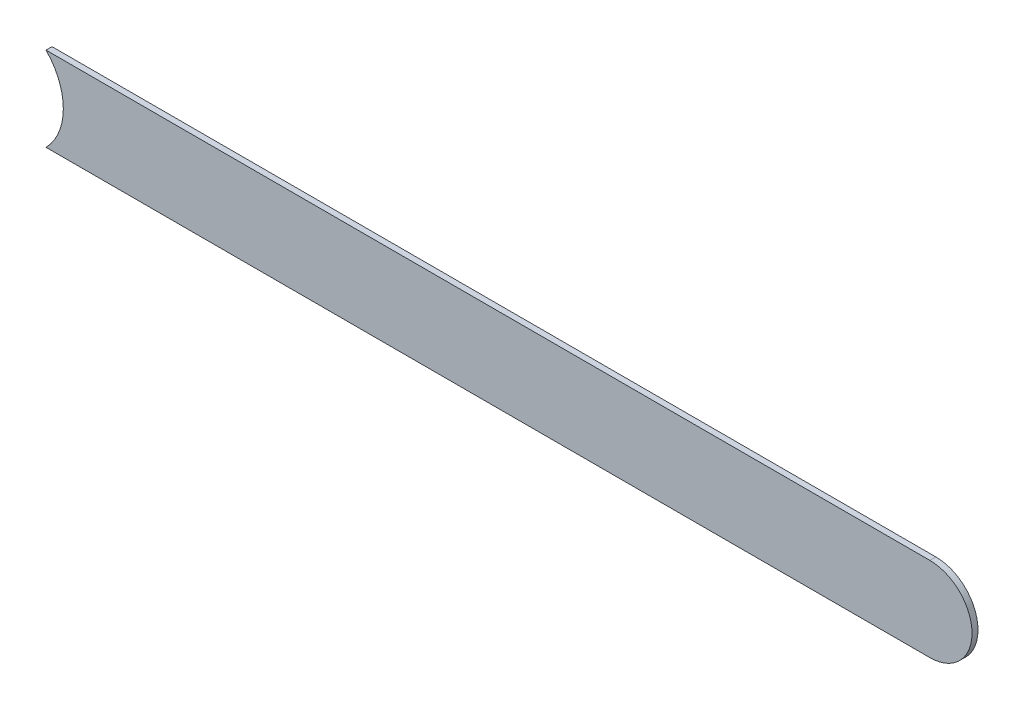
ISO-10303-21;
HEADER;
FILE_DESCRIPTION(('STEP AP214'),'2;1');
FILE_NAME('part.step','',(''),(''),'','','');
FILE_SCHEMA(('AUTOMOTIVE_DESIGN { 1 0 10303 214 1 1 1 1 }'));
ENDSEC;
DATA;
#1=APPLICATION_CONTEXT('core data for automotive mechanical design processes');
#2=APPLICATION_PROTOCOL_DEFINITION('international standard','automotive_design',2000,#1);
#3=PRODUCT_CONTEXT('',#1,'mechanical');
#4=PRODUCT('Part','Part','',(#3));
#5=PRODUCT_RELATED_PRODUCT_CATEGORY('part','',(#4));
#6=PRODUCT_DEFINITION_FORMATION('','',#4);
#7=PRODUCT_DEFINITION_CONTEXT('part definition',#1,'design');
#8=PRODUCT_DEFINITION('design','',#6,#7);
#9=PRODUCT_DEFINITION_SHAPE('','',#8);
#10=(LENGTH_UNIT() NAMED_UNIT(*) SI_UNIT(.MILLI.,.METRE.));
#11=(NAMED_UNIT(*) PLANE_ANGLE_UNIT() SI_UNIT($,.RADIAN.));
#12=(NAMED_UNIT(*) SI_UNIT($,.STERADIAN.) SOLID_ANGLE_UNIT());
#13=UNCERTAINTY_MEASURE_WITH_UNIT(LENGTH_MEASURE(1.E-05),#10,'distance_accuracy_value','');
#14=(GEOMETRIC_REPRESENTATION_CONTEXT(3) GLOBAL_UNCERTAINTY_ASSIGNED_CONTEXT((#13)) GLOBAL_UNIT_ASSIGNED_CONTEXT((#10,
#11,#12)) REPRESENTATION_CONTEXT('',''));
#15=CARTESIAN_POINT('',(0.,0.,0.));
#16=DIRECTION('',(0.,0.,1.));
#17=DIRECTION('',(1.,0.,0.));
#18=AXIS2_PLACEMENT_3D('',#15,#16,#17);
#19=CARTESIAN_POINT('',(57.1528870555931,107.2500014,0.));
#20=DIRECTION('',(0.,1.,0.));
#21=DIRECTION('',(1.,0.,0.));
#22=AXIS2_PLACEMENT_3D('',#19,#20,#21);
#23=PLANE('',#22);
#24=DIRECTION('',(1.,0.,0.));
#25=VECTOR('',#24,1.);
#26=CARTESIAN_POINT('',(56.9000005,107.2500014,0.03556));
#27=LINE('',#26,#25);
#28=CARTESIAN_POINT('',(57.1528870555931,107.2500014,0.03556));
#29=VERTEX_POINT('',#28);
#30=CARTESIAN_POINT('',(62.39999966,107.2500014,0.03556));
#31=VERTEX_POINT('',#30);
#32=EDGE_CURVE('E11',#29,#31,#27,.T.);
#33=ORIENTED_EDGE('',*,*,#32,.F.);
#34=DIRECTION('',(0.,0.,1.));
#35=VECTOR('',#34,1.);
#36=CARTESIAN_POINT('',(57.1528870555931,107.2500014,0.));
#37=LINE('',#36,#35);
#38=CARTESIAN_POINT('',(57.1528870555931,107.2500014,0.));
#39=VERTEX_POINT('',#38);
#40=EDGE_CURVE('E24',#39,#29,#37,.T.);
#41=ORIENTED_EDGE('',*,*,#40,.F.);
#42=DIRECTION('',(1.,0.,0.));
#43=VECTOR('',#42,1.);
#44=CARTESIAN_POINT('',(56.9000005,107.2500014,0.));
#45=LINE('',#44,#43);
#46=CARTESIAN_POINT('',(62.39999966,107.2500014,0.));
#47=VERTEX_POINT('',#46);
#48=EDGE_CURVE('E82',#39,#47,#45,.T.);
#49=ORIENTED_EDGE('',*,*,#48,.T.);
#50=DIRECTION('',(0.,0.,1.));
#51=VECTOR('',#50,1.);
#52=CARTESIAN_POINT('',(62.39999966,107.2500014,0.));
#53=LINE('',#52,#51);
#54=EDGE_CURVE('E37',#47,#31,#53,.T.);
#55=ORIENTED_EDGE('',*,*,#54,.T.);
#56=EDGE_LOOP('',(#33,#41,#49,#55));
#57=FACE_BOUND('',#56,.T.);
#58=ADVANCED_FACE('F17',(#57),#23,.F.);
#59=CARTESIAN_POINT('',(62.39999966,107.5000009,0.));
#60=DIRECTION('',(0.,0.,-1.));
#61=DIRECTION('',(0.,-1.,0.));
#62=AXIS2_PLACEMENT_3D('',#59,#60,#61);
#63=CYLINDRICAL_SURFACE('',#62,0.249999499999994);
#64=CARTESIAN_POINT('',(62.39999966,107.5000009,0.03556));
#65=DIRECTION('',(0.,0.,1.));
#66=DIRECTION('',(0.,-1.,0.));
#67=AXIS2_PLACEMENT_3D('',#64,#65,#66);
#68=CIRCLE('',#67,0.249999499999994);
#69=CARTESIAN_POINT('',(62.39999966,107.7500004,0.03556));
#70=VERTEX_POINT('',#69);
#71=EDGE_CURVE('E97',#31,#70,#68,.T.);
#72=ORIENTED_EDGE('',*,*,#71,.F.);
#73=ORIENTED_EDGE('',*,*,#54,.F.);
#74=CARTESIAN_POINT('',(62.39999966,107.5000009,0.));
#75=DIRECTION('',(0.,0.,1.));
#76=DIRECTION('',(0.,-1.,0.));
#77=AXIS2_PLACEMENT_3D('',#74,#75,#76);
#78=CIRCLE('',#77,0.249999499999994);
#79=CARTESIAN_POINT('',(62.39999966,107.7500004,0.));
#80=VERTEX_POINT('',#79);
#81=EDGE_CURVE('E94',#47,#80,#78,.T.);
#82=ORIENTED_EDGE('',*,*,#81,.T.);
#83=DIRECTION('',(0.,0.,1.));
#84=VECTOR('',#83,1.);
#85=CARTESIAN_POINT('',(62.39999966,107.7500004,0.));
#86=LINE('',#85,#84);
#87=EDGE_CURVE('E92',#80,#70,#86,.T.);
#88=ORIENTED_EDGE('',*,*,#87,.T.);
#89=EDGE_LOOP('',(#72,#73,#82,#88));
#90=FACE_BOUND('',#89,.T.);
#91=ADVANCED_FACE('F103',(#90),#63,.T.);
#92=CARTESIAN_POINT('',(62.39999966,107.7500004,0.));
#93=DIRECTION('',(0.,-1.,0.));
#94=DIRECTION('',(-1.,0.,0.));
#95=AXIS2_PLACEMENT_3D('',#92,#93,#94);
#96=PLANE('',#95);
#97=DIRECTION('',(-1.,0.,0.));
#98=VECTOR('',#97,1.);
#99=CARTESIAN_POINT('',(62.39999966,107.7500004,0.03556));
#100=LINE('',#99,#98);
#101=CARTESIAN_POINT('',(57.1528870555931,107.7500004,0.03556));
#102=VERTEX_POINT('',#101);
#103=EDGE_CURVE('E89',#70,#102,#100,.T.);
#104=ORIENTED_EDGE('',*,*,#103,.F.);
#105=ORIENTED_EDGE('',*,*,#87,.F.);
#106=DIRECTION('',(-1.,0.,0.));
#107=VECTOR('',#106,1.);
#108=CARTESIAN_POINT('',(62.39999966,107.7500004,0.));
#109=LINE('',#108,#107);
#110=CARTESIAN_POINT('',(57.1528870555931,107.7500004,0.));
#111=VERTEX_POINT('',#110);
#112=EDGE_CURVE('E87',#80,#111,#109,.T.);
#113=ORIENTED_EDGE('',*,*,#112,.T.);
#114=DIRECTION('',(0.,0.,1.));
#115=VECTOR('',#114,1.);
#116=CARTESIAN_POINT('',(57.1528870555931,107.7500004,0.));
#117=LINE('',#116,#115);
#118=EDGE_CURVE('E69',#111,#102,#117,.T.);
#119=ORIENTED_EDGE('',*,*,#118,.T.);
#120=EDGE_LOOP('',(#104,#105,#113,#119));
#121=FACE_BOUND('',#120,.T.);
#122=ADVANCED_FACE('F108',(#121),#96,.F.);
#123=CARTESIAN_POINT('',(56.9000005,107.5000009,0.));
#124=DIRECTION('',(0.,0.,-1.));
#125=DIRECTION('',(1.,0.,0.));
#126=AXIS2_PLACEMENT_3D('',#123,#124,#125);
#127=CYLINDRICAL_SURFACE('',#126,0.3556);
#128=DIRECTION('',(0.,0.,1.));
#129=VECTOR('',#128,1.);
#130=CARTESIAN_POINT('',(57.2556005,107.5000009,0.));
#131=LINE('',#130,#129);
#132=CARTESIAN_POINT('',(57.2556005,107.5000009,0.));
#133=VERTEX_POINT('',#132);
#134=CARTESIAN_POINT('',(57.2556005,107.5000009,0.03556));
#135=VERTEX_POINT('',#134);
#136=EDGE_CURVE('E59',#133,#135,#131,.T.);
#137=ORIENTED_EDGE('',*,*,#136,.T.);
#138=CARTESIAN_POINT('',(56.9000005,107.5000009,0.03556));
#139=DIRECTION('',(0.,0.,1.));
#140=DIRECTION('',(1.,0.,0.));
#141=AXIS2_PLACEMENT_3D('',#138,#139,#140);
#142=CIRCLE('',#141,0.3556);
#143=EDGE_CURVE('E70',#135,#102,#142,.T.);
#144=ORIENTED_EDGE('',*,*,#143,.T.);
#145=ORIENTED_EDGE('',*,*,#118,.F.);
#146=CARTESIAN_POINT('',(56.9000005,107.5000009,0.));
#147=DIRECTION('',(0.,0.,1.));
#148=DIRECTION('',(1.,0.,0.));
#149=AXIS2_PLACEMENT_3D('',#146,#147,#148);
#150=CIRCLE('',#149,0.3556);
#151=EDGE_CURVE('E73',#133,#111,#150,.T.);
#152=ORIENTED_EDGE('',*,*,#151,.F.);
#153=EDGE_LOOP('',(#137,#144,#145,#152));
#154=FACE_BOUND('',#153,.T.);
#155=ADVANCED_FACE('F74',(#154),#127,.F.);
#156=CARTESIAN_POINT('',(56.9000005,107.5000009,0.));
#157=DIRECTION('',(0.,0.,-1.));
#158=DIRECTION('',(1.,0.,0.));
#159=AXIS2_PLACEMENT_3D('',#156,#157,#158);
#160=CYLINDRICAL_SURFACE('',#159,0.3556);
#161=ORIENTED_EDGE('',*,*,#40,.T.);
#162=CARTESIAN_POINT('',(56.9000005,107.5000009,0.03556));
#163=DIRECTION('',(0.,0.,1.));
#164=DIRECTION('',(1.,0.,0.));
#165=AXIS2_PLACEMENT_3D('',#162,#163,#164);
#166=CIRCLE('',#165,0.3556);
#167=EDGE_CURVE('E65',#29,#135,#166,.T.);
#168=ORIENTED_EDGE('',*,*,#167,.T.);
#169=ORIENTED_EDGE('',*,*,#136,.F.);
#170=EDGE_CURVE('E63',#39,#133,#150,.T.);
#171=ORIENTED_EDGE('',*,*,#170,.F.);
#172=EDGE_LOOP('',(#161,#168,#169,#171));
#173=FACE_BOUND('',#172,.T.);
#174=ADVANCED_FACE('F61',(#173),#160,.F.);
#175=CARTESIAN_POINT('',(56.9000005,107.2500014,0.));
#176=DIRECTION('',(0.,0.,-1.));
#177=DIRECTION('',(-1.,0.,0.));
#178=AXIS2_PLACEMENT_3D('',#175,#176,#177);
#179=PLANE('',#178);
#180=ORIENTED_EDGE('',*,*,#48,.F.);
#181=ORIENTED_EDGE('',*,*,#170,.T.);
#182=ORIENTED_EDGE('',*,*,#151,.T.);
#183=ORIENTED_EDGE('',*,*,#112,.F.);
#184=ORIENTED_EDGE('',*,*,#81,.F.);
#185=EDGE_LOOP('',(#180,#181,#182,#183,#184));
#186=FACE_BOUND('',#185,.T.);
#187=ADVANCED_FACE('F80',(#186),#179,.T.);
#188=CARTESIAN_POINT('',(56.9000005,107.2500014,0.03556));
#189=DIRECTION('',(0.,0.,-1.));
#190=DIRECTION('',(-1.,0.,0.));
#191=AXIS2_PLACEMENT_3D('',#188,#189,#190);
#192=PLANE('',#191);
#193=ORIENTED_EDGE('',*,*,#167,.F.);
#194=ORIENTED_EDGE('',*,*,#32,.T.);
#195=ORIENTED_EDGE('',*,*,#71,.T.);
#196=ORIENTED_EDGE('',*,*,#103,.T.);
#197=ORIENTED_EDGE('',*,*,#143,.F.);
#198=EDGE_LOOP('',(#193,#194,#195,#196,#197));
#199=FACE_BOUND('',#198,.T.);
#200=ADVANCED_FACE('F106',(#199),#192,.F.);
#201=CLOSED_SHELL('',(#58,#91,#122,#155,#174,#187,#200));
#202=MANIFOLD_SOLID_BREP('B1',#201);
#203=ADVANCED_BREP_SHAPE_REPRESENTATION('',(#18,#202),#14);
#204=SHAPE_DEFINITION_REPRESENTATION(#9,#203);
ENDSEC;
END-ISO-10303-21;
